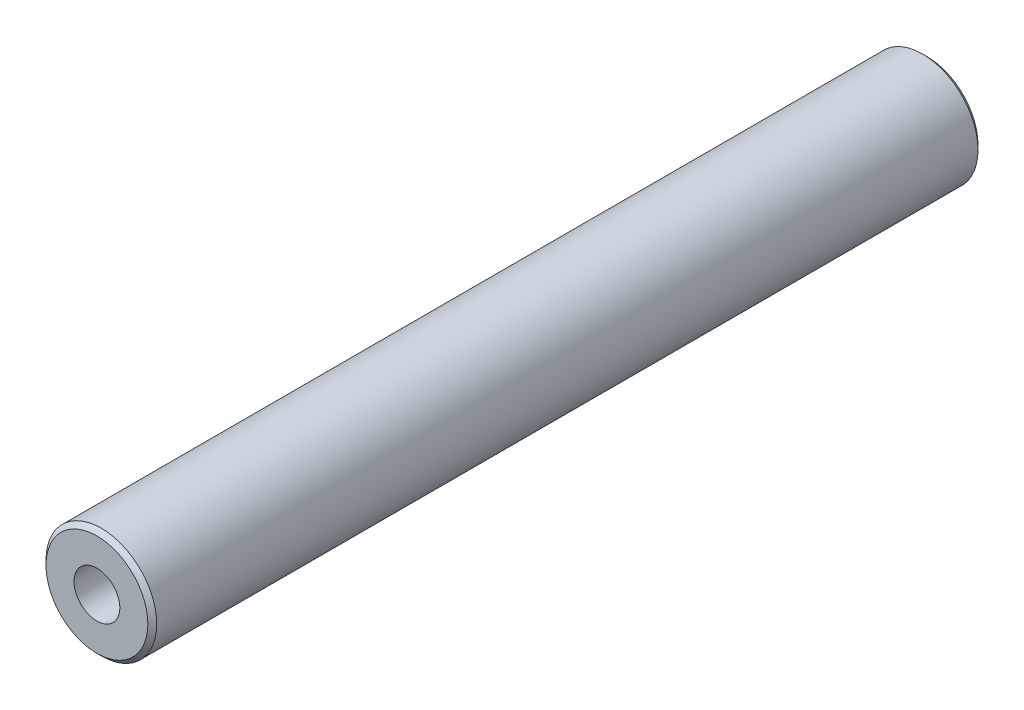
ISO-10303-21;
HEADER;
FILE_DESCRIPTION(('STEP AP214'),'2;1');
FILE_NAME('part.step','',(''),(''),'','','');
FILE_SCHEMA(('AUTOMOTIVE_DESIGN { 1 0 10303 214 1 1 1 1 }'));
ENDSEC;
DATA;
#1=APPLICATION_CONTEXT('core data for automotive mechanical design processes');
#2=APPLICATION_PROTOCOL_DEFINITION('international standard','automotive_design',2000,#1);
#3=PRODUCT_CONTEXT('',#1,'mechanical');
#4=PRODUCT('Part','Part','',(#3));
#5=PRODUCT_RELATED_PRODUCT_CATEGORY('part','',(#4));
#6=PRODUCT_DEFINITION_FORMATION('','',#4);
#7=PRODUCT_DEFINITION_CONTEXT('part definition',#1,'design');
#8=PRODUCT_DEFINITION('design','',#6,#7);
#9=PRODUCT_DEFINITION_SHAPE('','',#8);
#10=(LENGTH_UNIT() NAMED_UNIT(*) SI_UNIT(.MILLI.,.METRE.));
#11=(NAMED_UNIT(*) PLANE_ANGLE_UNIT() SI_UNIT($,.RADIAN.));
#12=(NAMED_UNIT(*) SI_UNIT($,.STERADIAN.) SOLID_ANGLE_UNIT());
#13=UNCERTAINTY_MEASURE_WITH_UNIT(LENGTH_MEASURE(1.E-05),#10,'distance_accuracy_value','');
#14=(GEOMETRIC_REPRESENTATION_CONTEXT(3) GLOBAL_UNCERTAINTY_ASSIGNED_CONTEXT((#13)) GLOBAL_UNIT_ASSIGNED_CONTEXT((#10,
#11,#12)) REPRESENTATION_CONTEXT('',''));
#15=CARTESIAN_POINT('',(0.,0.,0.));
#16=DIRECTION('',(0.,0.,1.));
#17=DIRECTION('',(1.,0.,0.));
#18=AXIS2_PLACEMENT_3D('',#15,#16,#17);
#19=CARTESIAN_POINT('',(0.,0.,60.8));
#20=DIRECTION('',(0.,0.,1.));
#21=DIRECTION('',(1.,0.,0.));
#22=AXIS2_PLACEMENT_3D('',#19,#20,#21);
#23=PLANE('',#22);
#24=CARTESIAN_POINT('',(0.,0.,60.8));
#25=DIRECTION('',(0.,0.,1.));
#26=DIRECTION('',(1.,0.,0.));
#27=AXIS2_PLACEMENT_3D('',#24,#25,#26);
#28=CIRCLE('',#27,2.067);
#29=CARTESIAN_POINT('',(-2.067,0.,60.8));
#30=VERTEX_POINT('',#29);
#31=EDGE_CURVE('E11',#30,#30,#28,.T.);
#32=ORIENTED_EDGE('',*,*,#31,.T.);
#33=EDGE_LOOP('',(#32));
#34=FACE_BOUND('',#33,.T.);
#35=ADVANCED_FACE('F17',(#34),#23,.T.);
#36=CARTESIAN_POINT('',(0.,0.,67.9));
#37=DIRECTION('',(0.,0.,1.));
#38=DIRECTION('',(1.,0.,0.));
#39=AXIS2_PLACEMENT_3D('',#36,#37,#38);
#40=CYLINDRICAL_SURFACE('',#39,2.067);
#41=CARTESIAN_POINT('',(0.,0.,75.));
#42=DIRECTION('',(0.,0.,-1.));
#43=DIRECTION('',(1.,0.,0.));
#44=AXIS2_PLACEMENT_3D('',#41,#42,#43);
#45=CIRCLE('',#44,2.067);
#46=CARTESIAN_POINT('',(-2.067,0.,75.));
#47=VERTEX_POINT('',#46);
#48=EDGE_CURVE('E77',#47,#47,#45,.T.);
#49=ORIENTED_EDGE('',*,*,#48,.F.);
#50=DIRECTION('',(0.,0.,-1.));
#51=VECTOR('',#50,1.);
#52=CARTESIAN_POINT('',(-2.067,0.,67.9));
#53=LINE('',#52,#51);
#54=EDGE_CURVE('E25',#47,#30,#53,.T.);
#55=ORIENTED_EDGE('',*,*,#54,.T.);
#56=ORIENTED_EDGE('',*,*,#31,.F.);
#57=ORIENTED_EDGE('',*,*,#54,.F.);
#58=EDGE_LOOP('',(#49,#55,#56,#57));
#59=FACE_BOUND('',#58,.T.);
#60=ADVANCED_FACE('F237',(#59),#40,.F.);
#61=CARTESIAN_POINT('',(0.,0.,14.2));
#62=DIRECTION('',(0.,0.,1.));
#63=DIRECTION('',(1.,0.,0.));
#64=AXIS2_PLACEMENT_3D('',#61,#62,#63);
#65=PLANE('',#64);
#66=CARTESIAN_POINT('',(0.,0.,14.2));
#67=DIRECTION('',(0.,0.,1.));
#68=DIRECTION('',(1.,0.,0.));
#69=AXIS2_PLACEMENT_3D('',#66,#67,#68);
#70=CIRCLE('',#69,2.067);
#71=CARTESIAN_POINT('',(-2.067,0.,14.2));
#72=VERTEX_POINT('',#71);
#73=EDGE_CURVE('E45',#72,#72,#70,.T.);
#74=ORIENTED_EDGE('',*,*,#73,.F.);
#75=EDGE_LOOP('',(#74));
#76=FACE_BOUND('',#75,.T.);
#77=ADVANCED_FACE('F232',(#76),#65,.F.);
#78=CARTESIAN_POINT('',(0.,0.,7.1));
#79=DIRECTION('',(0.,0.,1.));
#80=DIRECTION('',(1.,0.,0.));
#81=AXIS2_PLACEMENT_3D('',#78,#79,#80);
#82=CYLINDRICAL_SURFACE('',#81,2.067);
#83=CARTESIAN_POINT('',(0.,0.,0.));
#84=DIRECTION('',(0.,0.,1.));
#85=DIRECTION('',(1.,0.,0.));
#86=AXIS2_PLACEMENT_3D('',#83,#84,#85);
#87=CIRCLE('',#86,2.067);
#88=CARTESIAN_POINT('',(-2.067,0.,0.));
#89=VERTEX_POINT('',#88);
#90=EDGE_CURVE('E68',#89,#89,#87,.T.);
#91=ORIENTED_EDGE('',*,*,#90,.F.);
#92=DIRECTION('',(0.,0.,1.));
#93=VECTOR('',#92,1.);
#94=CARTESIAN_POINT('',(-2.067,0.,7.1));
#95=LINE('',#94,#93);
#96=EDGE_CURVE('E76',#89,#72,#95,.T.);
#97=ORIENTED_EDGE('',*,*,#96,.T.);
#98=ORIENTED_EDGE('',*,*,#73,.T.);
#99=ORIENTED_EDGE('',*,*,#96,.F.);
#100=EDGE_LOOP('',(#91,#97,#98,#99));
#101=FACE_BOUND('',#100,.T.);
#102=ADVANCED_FACE('F223',(#101),#82,.F.);
#103=CARTESIAN_POINT('',(0.,0.,0.));
#104=DIRECTION('',(0.,0.,1.));
#105=DIRECTION('',(1.,0.,0.));
#106=AXIS2_PLACEMENT_3D('',#103,#104,#105);
#107=PLANE('',#106);
#108=ORIENTED_EDGE('',*,*,#90,.T.);
#109=EDGE_LOOP('',(#108));
#110=FACE_BOUND('',#109,.T.);
#111=CARTESIAN_POINT('',(0.,0.,0.));
#112=DIRECTION('',(0.,0.,1.));
#113=DIRECTION('',(-1.,0.,0.));
#114=AXIS2_PLACEMENT_3D('',#111,#112,#113);
#115=CIRCLE('',#114,4.6);
#116=CARTESIAN_POINT('',(4.6,0.,0.));
#117=VERTEX_POINT('',#116);
#118=EDGE_CURVE('E61',#117,#117,#115,.T.);
#119=ORIENTED_EDGE('',*,*,#118,.F.);
#120=EDGE_LOOP('',(#119));
#121=FACE_BOUND('',#120,.T.);
#122=ADVANCED_FACE('F208',(#110,#121),#107,.F.);
#123=CARTESIAN_POINT('',(0.,0.,0.2));
#124=DIRECTION('',(0.,0.,1.));
#125=DIRECTION('',(-1.,0.,0.));
#126=AXIS2_PLACEMENT_3D('',#123,#124,#125);
#127=CONICAL_SURFACE('',#126,4.8,0.785398163397449);
#128=CARTESIAN_POINT('',(0.,0.,0.4));
#129=DIRECTION('',(0.,0.,-1.));
#130=DIRECTION('',(-1.,0.,0.));
#131=AXIS2_PLACEMENT_3D('',#128,#129,#130);
#132=CIRCLE('',#131,5.);
#133=CARTESIAN_POINT('',(5.,0.,0.4));
#134=VERTEX_POINT('',#133);
#135=CARTESIAN_POINT('',(-5.,0.,0.4));
#136=VERTEX_POINT('',#135);
#137=EDGE_CURVE('E83',#134,#136,#132,.T.);
#138=ORIENTED_EDGE('',*,*,#137,.T.);
#139=CARTESIAN_POINT('',(0.,0.,0.4));
#140=DIRECTION('',(0.,0.,-1.));
#141=DIRECTION('',(-1.,0.,0.));
#142=AXIS2_PLACEMENT_3D('',#139,#140,#141);
#143=CIRCLE('',#142,5.);
#144=EDGE_CURVE('E86',#136,#134,#143,.T.);
#145=ORIENTED_EDGE('',*,*,#144,.T.);
#146=DIRECTION('',(-0.707106781186548,0.,-0.707106781186547));
#147=VECTOR('',#146,1.);
#148=CARTESIAN_POINT('',(4.8,0.,0.2));
#149=LINE('',#148,#147);
#150=EDGE_CURVE('E64',#134,#117,#149,.T.);
#151=ORIENTED_EDGE('',*,*,#150,.T.);
#152=ORIENTED_EDGE('',*,*,#118,.T.);
#153=ORIENTED_EDGE('',*,*,#150,.F.);
#154=EDGE_LOOP('',(#138,#145,#151,#152,#153));
#155=FACE_BOUND('',#154,.T.);
#156=ADVANCED_FACE('F63',(#155),#127,.T.);
#157=CARTESIAN_POINT('',(0.,0.,75.));
#158=DIRECTION('',(0.,0.,1.));
#159=DIRECTION('',(1.,0.,0.));
#160=AXIS2_PLACEMENT_3D('',#157,#158,#159);
#161=PLANE('',#160);
#162=ORIENTED_EDGE('',*,*,#48,.T.);
#163=EDGE_LOOP('',(#162));
#164=FACE_BOUND('',#163,.T.);
#165=CARTESIAN_POINT('',(0.,0.,75.));
#166=DIRECTION('',(0.,0.,-1.));
#167=DIRECTION('',(-1.,0.,0.));
#168=AXIS2_PLACEMENT_3D('',#165,#166,#167);
#169=CIRCLE('',#168,4.6);
#170=CARTESIAN_POINT('',(4.6,0.,75.));
#171=VERTEX_POINT('',#170);
#172=EDGE_CURVE('E104',#171,#171,#169,.T.);
#173=ORIENTED_EDGE('',*,*,#172,.F.);
#174=EDGE_LOOP('',(#173));
#175=FACE_BOUND('',#174,.T.);
#176=ADVANCED_FACE('F199',(#164,#175),#161,.T.);
#177=CARTESIAN_POINT('',(0.,0.,0.));
#178=DIRECTION('',(0.,0.,1.));
#179=DIRECTION('',(1.,0.,0.));
#180=AXIS2_PLACEMENT_3D('',#177,#178,#179);
#181=CYLINDRICAL_SURFACE('',#180,5.);
#182=CARTESIAN_POINT('',(0.,0.,74.6));
#183=DIRECTION('',(0.,0.,1.));
#184=DIRECTION('',(-1.,0.,0.));
#185=AXIS2_PLACEMENT_3D('',#182,#183,#184);
#186=CIRCLE('',#185,5.);
#187=CARTESIAN_POINT('',(5.,0.,74.6));
#188=VERTEX_POINT('',#187);
#189=CARTESIAN_POINT('',(-5.,0.,74.6));
#190=VERTEX_POINT('',#189);
#191=EDGE_CURVE('E109',#188,#190,#186,.T.);
#192=ORIENTED_EDGE('',*,*,#191,.F.);
#193=CARTESIAN_POINT('',(0.,0.,74.6));
#194=DIRECTION('',(0.,0.,1.));
#195=DIRECTION('',(-1.,0.,0.));
#196=AXIS2_PLACEMENT_3D('',#193,#194,#195);
#197=CIRCLE('',#196,5.);
#198=EDGE_CURVE('E114',#190,#188,#197,.T.);
#199=ORIENTED_EDGE('',*,*,#198,.F.);
#200=DIRECTION('',(0.,0.,-1.));
#201=VECTOR('',#200,1.);
#202=CARTESIAN_POINT('',(-5.,0.,0.));
#203=LINE('',#202,#201);
#204=EDGE_CURVE('E81',#190,#136,#203,.T.);
#205=ORIENTED_EDGE('',*,*,#204,.T.);
#206=ORIENTED_EDGE('',*,*,#137,.F.);
#207=ORIENTED_EDGE('',*,*,#144,.F.);
#208=ORIENTED_EDGE('',*,*,#204,.F.);
#209=EDGE_LOOP('',(#192,#199,#205,#206,#207,#208));
#210=FACE_BOUND('',#209,.T.);
#211=ADVANCED_FACE('F132',(#210),#181,.T.);
#212=CARTESIAN_POINT('',(0.,0.,74.8));
#213=DIRECTION('',(0.,0.,-1.));
#214=DIRECTION('',(-1.,0.,0.));
#215=AXIS2_PLACEMENT_3D('',#212,#213,#214);
#216=CONICAL_SURFACE('',#215,4.8,0.785398163397448);
#217=ORIENTED_EDGE('',*,*,#172,.T.);
#218=DIRECTION('',(0.707106781186548,0.,-0.707106781186548));
#219=VECTOR('',#218,1.);
#220=CARTESIAN_POINT('',(4.8,0.,74.8));
#221=LINE('',#220,#219);
#222=EDGE_CURVE('E105',#171,#188,#221,.T.);
#223=ORIENTED_EDGE('',*,*,#222,.T.);
#224=ORIENTED_EDGE('',*,*,#191,.T.);
#225=ORIENTED_EDGE('',*,*,#198,.T.);
#226=ORIENTED_EDGE('',*,*,#222,.F.);
#227=EDGE_LOOP('',(#217,#223,#224,#225,#226));
#228=FACE_BOUND('',#227,.T.);
#229=ADVANCED_FACE('F147',(#228),#216,.T.);
#230=CLOSED_SHELL('',(#35,#60,#77,#102,#122,#156,#176,#211,#229));
#231=MANIFOLD_SOLID_BREP('B1',#230);
#232=ADVANCED_BREP_SHAPE_REPRESENTATION('',(#18,#231),#14);
#233=SHAPE_DEFINITION_REPRESENTATION(#9,#232);
ENDSEC;
END-ISO-10303-21;
